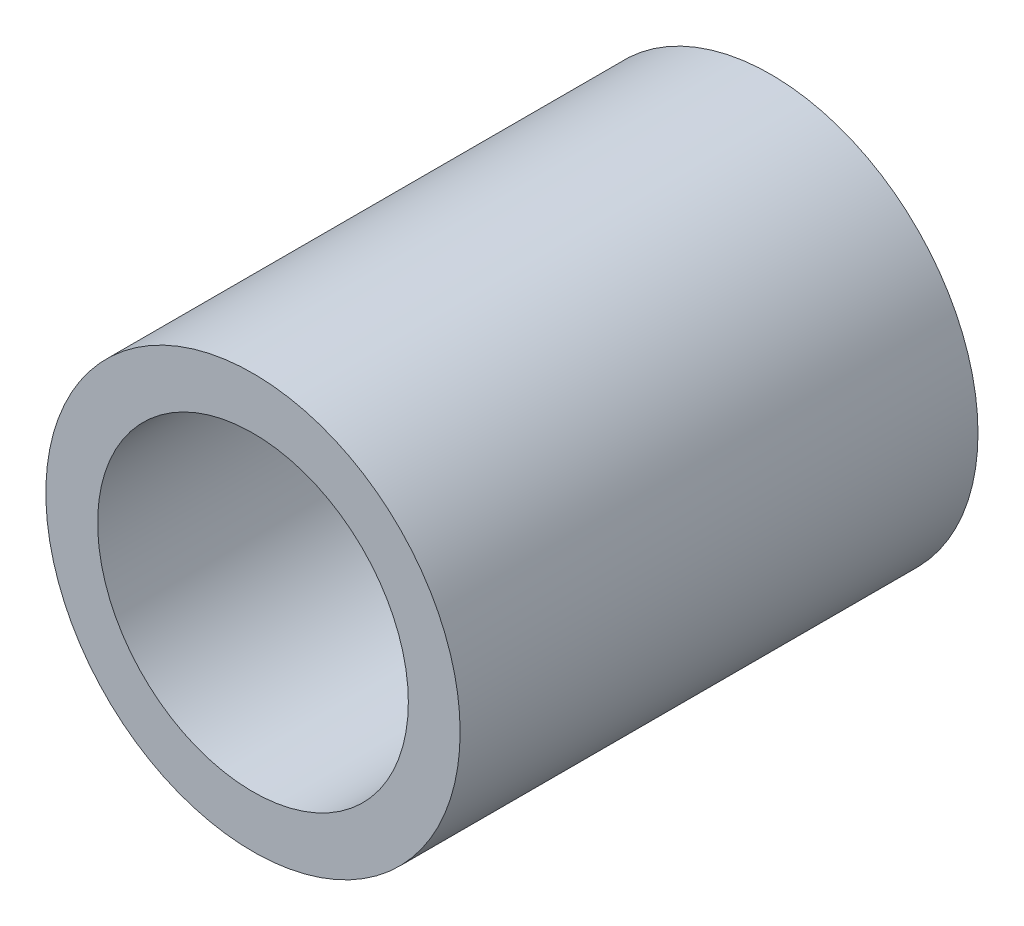
ISO-10303-21;
HEADER;
FILE_DESCRIPTION(('STEP AP214'),'2;1');
FILE_NAME('part.step','',(''),(''),'','','');
FILE_SCHEMA(('AUTOMOTIVE_DESIGN { 1 0 10303 214 1 1 1 1 }'));
ENDSEC;
DATA;
#1=APPLICATION_CONTEXT('core data for automotive mechanical design processes');
#2=APPLICATION_PROTOCOL_DEFINITION('international standard','automotive_design',2000,#1);
#3=PRODUCT_CONTEXT('',#1,'mechanical');
#4=PRODUCT('Part','Part','',(#3));
#5=PRODUCT_RELATED_PRODUCT_CATEGORY('part','',(#4));
#6=PRODUCT_DEFINITION_FORMATION('','',#4);
#7=PRODUCT_DEFINITION_CONTEXT('part definition',#1,'design');
#8=PRODUCT_DEFINITION('design','',#6,#7);
#9=PRODUCT_DEFINITION_SHAPE('','',#8);
#10=(LENGTH_UNIT() NAMED_UNIT(*) SI_UNIT(.MILLI.,.METRE.));
#11=(NAMED_UNIT(*) PLANE_ANGLE_UNIT() SI_UNIT($,.RADIAN.));
#12=(NAMED_UNIT(*) SI_UNIT($,.STERADIAN.) SOLID_ANGLE_UNIT());
#13=UNCERTAINTY_MEASURE_WITH_UNIT(LENGTH_MEASURE(1.E-05),#10,'distance_accuracy_value','');
#14=(GEOMETRIC_REPRESENTATION_CONTEXT(3) GLOBAL_UNCERTAINTY_ASSIGNED_CONTEXT((#13)) GLOBAL_UNIT_ASSIGNED_CONTEXT((#10,
#11,#12)) REPRESENTATION_CONTEXT('',''));
#15=CARTESIAN_POINT('',(0.,0.,0.));
#16=DIRECTION('',(0.,0.,1.));
#17=DIRECTION('',(1.,0.,0.));
#18=AXIS2_PLACEMENT_3D('',#15,#16,#17);
#19=CARTESIAN_POINT('',(0.,0.,20.));
#20=DIRECTION('',(0.,0.,1.));
#21=DIRECTION('',(1.,0.,0.));
#22=AXIS2_PLACEMENT_3D('',#19,#20,#21);
#23=PLANE('',#22);
#24=CARTESIAN_POINT('',(0.,0.,20.));
#25=DIRECTION('',(0.,0.,1.));
#26=DIRECTION('',(1.,0.,0.));
#27=AXIS2_PLACEMENT_3D('',#24,#25,#26);
#28=CIRCLE('',#27,8.);
#29=CARTESIAN_POINT('',(8.,0.,20.));
#30=VERTEX_POINT('',#29);
#31=EDGE_CURVE('E10',#30,#30,#28,.T.);
#32=ORIENTED_EDGE('',*,*,#31,.T.);
#33=EDGE_LOOP('',(#32));
#34=FACE_BOUND('',#33,.T.);
#35=CARTESIAN_POINT('',(0.,0.,20.));
#36=DIRECTION('',(0.,0.,1.));
#37=DIRECTION('',(1.,0.,0.));
#38=AXIS2_PLACEMENT_3D('',#35,#36,#37);
#39=CIRCLE('',#38,6.);
#40=CARTESIAN_POINT('',(6.,0.,20.));
#41=VERTEX_POINT('',#40);
#42=EDGE_CURVE('E60',#41,#41,#39,.T.);
#43=ORIENTED_EDGE('',*,*,#42,.F.);
#44=EDGE_LOOP('',(#43));
#45=FACE_BOUND('',#44,.T.);
#46=ADVANCED_FACE('F47',(#34,#45),#23,.T.);
#47=CARTESIAN_POINT('',(0.,0.,0.));
#48=DIRECTION('',(0.,0.,1.));
#49=DIRECTION('',(1.,0.,0.));
#50=AXIS2_PLACEMENT_3D('',#47,#48,#49);
#51=PLANE('',#50);
#52=CARTESIAN_POINT('',(0.,0.,0.));
#53=DIRECTION('',(0.,0.,1.));
#54=DIRECTION('',(1.,0.,0.));
#55=AXIS2_PLACEMENT_3D('',#52,#53,#54);
#56=CIRCLE('',#55,8.);
#57=CARTESIAN_POINT('',(8.,0.,0.));
#58=VERTEX_POINT('',#57);
#59=EDGE_CURVE('E51',#58,#58,#56,.T.);
#60=ORIENTED_EDGE('',*,*,#59,.F.);
#61=EDGE_LOOP('',(#60));
#62=FACE_BOUND('',#61,.T.);
#63=CARTESIAN_POINT('',(0.,0.,0.));
#64=DIRECTION('',(0.,0.,1.));
#65=DIRECTION('',(1.,0.,0.));
#66=AXIS2_PLACEMENT_3D('',#63,#64,#65);
#67=CIRCLE('',#66,6.);
#68=CARTESIAN_POINT('',(6.,0.,0.));
#69=VERTEX_POINT('',#68);
#70=EDGE_CURVE('E62',#69,#69,#67,.T.);
#71=ORIENTED_EDGE('',*,*,#70,.T.);
#72=EDGE_LOOP('',(#71));
#73=FACE_BOUND('',#72,.T.);
#74=ADVANCED_FACE('F74',(#62,#73),#51,.F.);
#75=CARTESIAN_POINT('',(0.,0.,20.));
#76=DIRECTION('',(0.,0.,-1.));
#77=DIRECTION('',(-1.,0.,0.));
#78=AXIS2_PLACEMENT_3D('',#75,#76,#77);
#79=CYLINDRICAL_SURFACE('',#78,8.);
#80=ORIENTED_EDGE('',*,*,#31,.F.);
#81=EDGE_LOOP('',(#80));
#82=FACE_BOUND('',#81,.T.);
#83=ORIENTED_EDGE('',*,*,#59,.T.);
#84=EDGE_LOOP('',(#83));
#85=FACE_BOUND('',#84,.T.);
#86=ADVANCED_FACE('F49',(#82,#85),#79,.T.);
#87=CARTESIAN_POINT('',(0.,0.,20.));
#88=DIRECTION('',(0.,0.,-1.));
#89=DIRECTION('',(-1.,0.,0.));
#90=AXIS2_PLACEMENT_3D('',#87,#88,#89);
#91=CYLINDRICAL_SURFACE('',#90,6.);
#92=ORIENTED_EDGE('',*,*,#42,.T.);
#93=EDGE_LOOP('',(#92));
#94=FACE_BOUND('',#93,.T.);
#95=ORIENTED_EDGE('',*,*,#70,.F.);
#96=EDGE_LOOP('',(#95));
#97=FACE_BOUND('',#96,.T.);
#98=ADVANCED_FACE('F70',(#94,#97),#91,.F.);
#99=CLOSED_SHELL('',(#46,#74,#86,#98));
#100=MANIFOLD_SOLID_BREP('B2',#99);
#101=ADVANCED_BREP_SHAPE_REPRESENTATION('',(#18,#100),#14);
#102=SHAPE_DEFINITION_REPRESENTATION(#9,#101);
ENDSEC;
END-ISO-10303-21;
